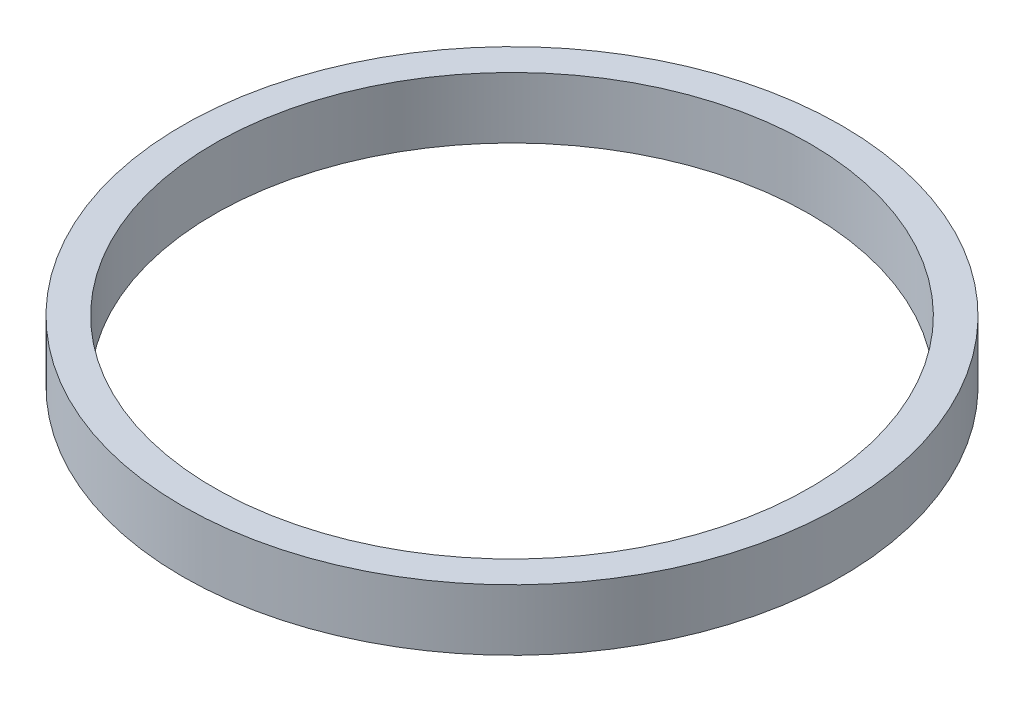
ISO-10303-21;
HEADER;
FILE_DESCRIPTION(('STEP AP214'),'2;1');
FILE_NAME('part.step','',(''),(''),'','','');
FILE_SCHEMA(('AUTOMOTIVE_DESIGN { 1 0 10303 214 1 1 1 1 }'));
ENDSEC;
DATA;
#1=APPLICATION_CONTEXT('core data for automotive mechanical design processes');
#2=APPLICATION_PROTOCOL_DEFINITION('international standard','automotive_design',2000,#1);
#3=PRODUCT_CONTEXT('',#1,'mechanical');
#4=PRODUCT('Part','Part','',(#3));
#5=PRODUCT_RELATED_PRODUCT_CATEGORY('part','',(#4));
#6=PRODUCT_DEFINITION_FORMATION('','',#4);
#7=PRODUCT_DEFINITION_CONTEXT('part definition',#1,'design');
#8=PRODUCT_DEFINITION('design','',#6,#7);
#9=PRODUCT_DEFINITION_SHAPE('','',#8);
#10=(LENGTH_UNIT() NAMED_UNIT(*) SI_UNIT(.MILLI.,.METRE.));
#11=(NAMED_UNIT(*) PLANE_ANGLE_UNIT() SI_UNIT($,.RADIAN.));
#12=(NAMED_UNIT(*) SI_UNIT($,.STERADIAN.) SOLID_ANGLE_UNIT());
#13=UNCERTAINTY_MEASURE_WITH_UNIT(LENGTH_MEASURE(1.E-05),#10,'distance_accuracy_value','');
#14=(GEOMETRIC_REPRESENTATION_CONTEXT(3) GLOBAL_UNCERTAINTY_ASSIGNED_CONTEXT((#13)) GLOBAL_UNIT_ASSIGNED_CONTEXT((#10,
#11,#12)) REPRESENTATION_CONTEXT('',''));
#15=CARTESIAN_POINT('',(0.,0.,0.));
#16=DIRECTION('',(0.,0.,1.));
#17=DIRECTION('',(1.,0.,0.));
#18=AXIS2_PLACEMENT_3D('',#15,#16,#17);
#19=CARTESIAN_POINT('',(0.,0.,0.));
#20=DIRECTION('',(0.,-1.,0.));
#21=DIRECTION('',(0.,0.,-1.));
#22=AXIS2_PLACEMENT_3D('',#19,#20,#21);
#23=CYLINDRICAL_SURFACE('',#22,14.0462);
#24=CARTESIAN_POINT('',(0.,0.,0.));
#25=DIRECTION('',(0.,-1.,0.));
#26=DIRECTION('',(0.,0.,-1.));
#27=AXIS2_PLACEMENT_3D('',#24,#25,#26);
#28=CIRCLE('',#27,14.0462);
#29=CARTESIAN_POINT('',(0.,0.,-14.0462));
#30=VERTEX_POINT('',#29);
#31=EDGE_CURVE('E10',#30,#30,#28,.T.);
#32=ORIENTED_EDGE('',*,*,#31,.F.);
#33=EDGE_LOOP('',(#32));
#34=FACE_BOUND('',#33,.T.);
#35=CARTESIAN_POINT('',(0.,2.6035,0.));
#36=DIRECTION('',(0.,-1.,0.));
#37=DIRECTION('',(0.,0.,-1.));
#38=AXIS2_PLACEMENT_3D('',#35,#36,#37);
#39=CIRCLE('',#38,14.0462);
#40=CARTESIAN_POINT('',(0.,2.6035,-14.0462));
#41=VERTEX_POINT('',#40);
#42=EDGE_CURVE('E45',#41,#41,#39,.T.);
#43=ORIENTED_EDGE('',*,*,#42,.T.);
#44=EDGE_LOOP('',(#43));
#45=FACE_BOUND('',#44,.T.);
#46=ADVANCED_FACE('F31',(#34,#45),#23,.T.);
#47=CARTESIAN_POINT('',(-12.7,0.,0.));
#48=DIRECTION('',(0.,1.,0.));
#49=DIRECTION('',(0.,0.,1.));
#50=AXIS2_PLACEMENT_3D('',#47,#48,#49);
#51=PLANE('',#50);
#52=CARTESIAN_POINT('',(0.,0.,0.));
#53=DIRECTION('',(0.,-1.,0.));
#54=DIRECTION('',(0.,0.,-1.));
#55=AXIS2_PLACEMENT_3D('',#52,#53,#54);
#56=CIRCLE('',#55,12.7);
#57=CARTESIAN_POINT('',(0.,0.,-12.7));
#58=VERTEX_POINT('',#57);
#59=EDGE_CURVE('E37',#58,#58,#56,.T.);
#60=ORIENTED_EDGE('',*,*,#59,.F.);
#61=EDGE_LOOP('',(#60));
#62=FACE_BOUND('',#61,.T.);
#63=ORIENTED_EDGE('',*,*,#31,.T.);
#64=EDGE_LOOP('',(#63));
#65=FACE_BOUND('',#64,.T.);
#66=ADVANCED_FACE('F60',(#62,#65),#51,.F.);
#67=CARTESIAN_POINT('',(0.,0.,0.));
#68=DIRECTION('',(0.,-1.,0.));
#69=DIRECTION('',(0.,0.,-1.));
#70=AXIS2_PLACEMENT_3D('',#67,#68,#69);
#71=CYLINDRICAL_SURFACE('',#70,12.7);
#72=CARTESIAN_POINT('',(0.,2.6035,0.));
#73=DIRECTION('',(0.,-1.,0.));
#74=DIRECTION('',(0.,0.,-1.));
#75=AXIS2_PLACEMENT_3D('',#72,#73,#74);
#76=CIRCLE('',#75,12.7);
#77=CARTESIAN_POINT('',(0.,2.6035,-12.7));
#78=VERTEX_POINT('',#77);
#79=EDGE_CURVE('E41',#78,#78,#76,.T.);
#80=ORIENTED_EDGE('',*,*,#79,.F.);
#81=EDGE_LOOP('',(#80));
#82=FACE_BOUND('',#81,.T.);
#83=ORIENTED_EDGE('',*,*,#59,.T.);
#84=EDGE_LOOP('',(#83));
#85=FACE_BOUND('',#84,.T.);
#86=ADVANCED_FACE('F55',(#82,#85),#71,.F.);
#87=CARTESIAN_POINT('',(-12.7,2.6035,0.));
#88=DIRECTION('',(0.,-1.,0.));
#89=DIRECTION('',(0.,0.,-1.));
#90=AXIS2_PLACEMENT_3D('',#87,#88,#89);
#91=PLANE('',#90);
#92=ORIENTED_EDGE('',*,*,#42,.F.);
#93=EDGE_LOOP('',(#92));
#94=FACE_BOUND('',#93,.T.);
#95=ORIENTED_EDGE('',*,*,#79,.T.);
#96=EDGE_LOOP('',(#95));
#97=FACE_BOUND('',#96,.T.);
#98=ADVANCED_FACE('F52',(#94,#97),#91,.F.);
#99=CLOSED_SHELL('',(#46,#66,#86,#98));
#100=MANIFOLD_SOLID_BREP('B2',#99);
#101=ADVANCED_BREP_SHAPE_REPRESENTATION('',(#18,#100),#14);
#102=SHAPE_DEFINITION_REPRESENTATION(#9,#101);
ENDSEC;
END-ISO-10303-21;
